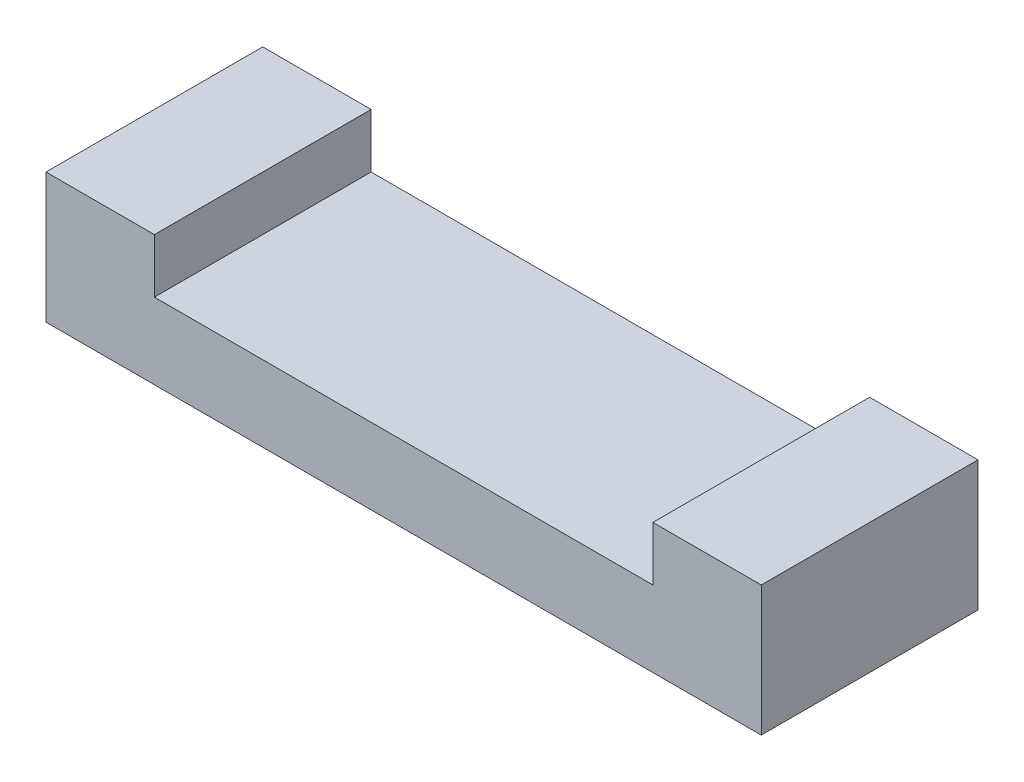
ISO-10303-21;
HEADER;
FILE_DESCRIPTION(('STEP AP214'),'2;1');
FILE_NAME('part.step','',(''),(''),'','','');
FILE_SCHEMA(('AUTOMOTIVE_DESIGN { 1 0 10303 214 1 1 1 1 }'));
ENDSEC;
DATA;
#1=APPLICATION_CONTEXT('core data for automotive mechanical design processes');
#2=APPLICATION_PROTOCOL_DEFINITION('international standard','automotive_design',2000,#1);
#3=PRODUCT_CONTEXT('',#1,'mechanical');
#4=PRODUCT('Part','Part','',(#3));
#5=PRODUCT_RELATED_PRODUCT_CATEGORY('part','',(#4));
#6=PRODUCT_DEFINITION_FORMATION('','',#4);
#7=PRODUCT_DEFINITION_CONTEXT('part definition',#1,'design');
#8=PRODUCT_DEFINITION('design','',#6,#7);
#9=PRODUCT_DEFINITION_SHAPE('','',#8);
#10=(LENGTH_UNIT() NAMED_UNIT(*) SI_UNIT(.MILLI.,.METRE.));
#11=(NAMED_UNIT(*) PLANE_ANGLE_UNIT() SI_UNIT($,.RADIAN.));
#12=(NAMED_UNIT(*) SI_UNIT($,.STERADIAN.) SOLID_ANGLE_UNIT());
#13=UNCERTAINTY_MEASURE_WITH_UNIT(LENGTH_MEASURE(1.E-05),#10,'distance_accuracy_value','');
#14=(GEOMETRIC_REPRESENTATION_CONTEXT(3) GLOBAL_UNCERTAINTY_ASSIGNED_CONTEXT((#13)) GLOBAL_UNIT_ASSIGNED_CONTEXT((#10,
#11,#12)) REPRESENTATION_CONTEXT('',''));
#15=CARTESIAN_POINT('',(0.,0.,0.));
#16=DIRECTION('',(0.,0.,1.));
#17=DIRECTION('',(1.,0.,0.));
#18=AXIS2_PLACEMENT_3D('',#15,#16,#17);
#19=CARTESIAN_POINT('',(-17.0073529411765,-3.5,10.));
#20=DIRECTION('',(1.,0.,0.));
#21=DIRECTION('',(0.,0.,-1.));
#22=AXIS2_PLACEMENT_3D('',#19,#20,#21);
#23=PLANE('',#22);
#24=DIRECTION('',(0.,-1.,0.));
#25=VECTOR('',#24,1.);
#26=CARTESIAN_POINT('',(-17.0073529411765,-3.5,0.));
#27=LINE('',#26,#25);
#28=CARTESIAN_POINT('',(-17.0073529411765,2.5,0.));
#29=VERTEX_POINT('',#28);
#30=CARTESIAN_POINT('',(-17.0073529411765,-3.5,0.));
#31=VERTEX_POINT('',#30);
#32=EDGE_CURVE('E130',#29,#31,#27,.T.);
#33=ORIENTED_EDGE('',*,*,#32,.T.);
#34=DIRECTION('',(0.,0.,-1.));
#35=VECTOR('',#34,1.);
#36=CARTESIAN_POINT('',(-17.0073529411765,-3.5,10.));
#37=LINE('',#36,#35);
#38=CARTESIAN_POINT('',(-17.0073529411765,-3.5,10.));
#39=VERTEX_POINT('',#38);
#40=EDGE_CURVE('E11',#39,#31,#37,.T.);
#41=ORIENTED_EDGE('',*,*,#40,.F.);
#42=DIRECTION('',(0.,-1.,0.));
#43=VECTOR('',#42,1.);
#44=CARTESIAN_POINT('',(-17.0073529411765,-3.5,10.));
#45=LINE('',#44,#43);
#46=CARTESIAN_POINT('',(-17.0073529411765,2.5,10.));
#47=VERTEX_POINT('',#46);
#48=EDGE_CURVE('E144',#47,#39,#45,.T.);
#49=ORIENTED_EDGE('',*,*,#48,.F.);
#50=DIRECTION('',(0.,0.,-1.));
#51=VECTOR('',#50,1.);
#52=CARTESIAN_POINT('',(-17.0073529411765,2.5,10.));
#53=LINE('',#52,#51);
#54=EDGE_CURVE('E126',#47,#29,#53,.T.);
#55=ORIENTED_EDGE('',*,*,#54,.T.);
#56=EDGE_LOOP('',(#33,#41,#49,#55));
#57=FACE_BOUND('',#56,.T.);
#58=ADVANCED_FACE('F34',(#57),#23,.F.);
#59=CARTESIAN_POINT('',(15.9926470588235,-3.5,10.));
#60=DIRECTION('',(0.,1.,0.));
#61=DIRECTION('',(-1.,0.,0.));
#62=AXIS2_PLACEMENT_3D('',#59,#60,#61);
#63=PLANE('',#62);
#64=DIRECTION('',(1.,0.,0.));
#65=VECTOR('',#64,1.);
#66=CARTESIAN_POINT('',(15.9926470588235,-3.5,0.));
#67=LINE('',#66,#65);
#68=CARTESIAN_POINT('',(15.9926470588235,-3.5,0.));
#69=VERTEX_POINT('',#68);
#70=EDGE_CURVE('E133',#31,#69,#67,.T.);
#71=ORIENTED_EDGE('',*,*,#70,.T.);
#72=DIRECTION('',(0.,0.,-1.));
#73=VECTOR('',#72,1.);
#74=CARTESIAN_POINT('',(15.9926470588235,-3.5,10.));
#75=LINE('',#74,#73);
#76=CARTESIAN_POINT('',(15.9926470588235,-3.5,10.));
#77=VERTEX_POINT('',#76);
#78=EDGE_CURVE('E42',#77,#69,#75,.T.);
#79=ORIENTED_EDGE('',*,*,#78,.F.);
#80=DIRECTION('',(1.,0.,0.));
#81=VECTOR('',#80,1.);
#82=CARTESIAN_POINT('',(15.9926470588235,-3.5,10.));
#83=LINE('',#82,#81);
#84=EDGE_CURVE('E93',#39,#77,#83,.T.);
#85=ORIENTED_EDGE('',*,*,#84,.F.);
#86=ORIENTED_EDGE('',*,*,#40,.T.);
#87=EDGE_LOOP('',(#71,#79,#85,#86));
#88=FACE_BOUND('',#87,.T.);
#89=ADVANCED_FACE('F179',(#88),#63,.F.);
#90=CARTESIAN_POINT('',(15.9926470588235,2.5,10.));
#91=DIRECTION('',(-1.,0.,0.));
#92=DIRECTION('',(0.,-1.,0.));
#93=AXIS2_PLACEMENT_3D('',#90,#91,#92);
#94=PLANE('',#93);
#95=DIRECTION('',(0.,1.,0.));
#96=VECTOR('',#95,1.);
#97=CARTESIAN_POINT('',(15.9926470588235,2.5,0.));
#98=LINE('',#97,#96);
#99=CARTESIAN_POINT('',(15.9926470588235,2.5,0.));
#100=VERTEX_POINT('',#99);
#101=EDGE_CURVE('E135',#69,#100,#98,.T.);
#102=ORIENTED_EDGE('',*,*,#101,.T.);
#103=DIRECTION('',(0.,0.,-1.));
#104=VECTOR('',#103,1.);
#105=CARTESIAN_POINT('',(15.9926470588235,2.5,10.));
#106=LINE('',#105,#104);
#107=CARTESIAN_POINT('',(15.9926470588235,2.5,10.));
#108=VERTEX_POINT('',#107);
#109=EDGE_CURVE('E151',#108,#100,#106,.T.);
#110=ORIENTED_EDGE('',*,*,#109,.F.);
#111=DIRECTION('',(0.,1.,0.));
#112=VECTOR('',#111,1.);
#113=CARTESIAN_POINT('',(15.9926470588235,2.5,10.));
#114=LINE('',#113,#112);
#115=EDGE_CURVE('E159',#77,#108,#114,.T.);
#116=ORIENTED_EDGE('',*,*,#115,.F.);
#117=ORIENTED_EDGE('',*,*,#78,.T.);
#118=EDGE_LOOP('',(#102,#110,#116,#117));
#119=FACE_BOUND('',#118,.T.);
#120=ADVANCED_FACE('F157',(#119),#94,.F.);
#121=CARTESIAN_POINT('',(10.9926470588235,2.5,10.));
#122=DIRECTION('',(0.,-1.,0.));
#123=DIRECTION('',(0.,0.,-1.));
#124=AXIS2_PLACEMENT_3D('',#121,#122,#123);
#125=PLANE('',#124);
#126=DIRECTION('',(-1.,0.,0.));
#127=VECTOR('',#126,1.);
#128=CARTESIAN_POINT('',(10.9926470588235,2.5,0.));
#129=LINE('',#128,#127);
#130=CARTESIAN_POINT('',(10.9926470588235,2.5,0.));
#131=VERTEX_POINT('',#130);
#132=EDGE_CURVE('E137',#100,#131,#129,.T.);
#133=ORIENTED_EDGE('',*,*,#132,.T.);
#134=DIRECTION('',(0.,0.,-1.));
#135=VECTOR('',#134,1.);
#136=CARTESIAN_POINT('',(10.9926470588235,2.5,10.));
#137=LINE('',#136,#135);
#138=CARTESIAN_POINT('',(10.9926470588235,2.5,10.));
#139=VERTEX_POINT('',#138);
#140=EDGE_CURVE('E148',#139,#131,#137,.T.);
#141=ORIENTED_EDGE('',*,*,#140,.F.);
#142=DIRECTION('',(-1.,0.,0.));
#143=VECTOR('',#142,1.);
#144=CARTESIAN_POINT('',(10.9926470588235,2.5,10.));
#145=LINE('',#144,#143);
#146=EDGE_CURVE('E171',#108,#139,#145,.T.);
#147=ORIENTED_EDGE('',*,*,#146,.F.);
#148=ORIENTED_EDGE('',*,*,#109,.T.);
#149=EDGE_LOOP('',(#133,#141,#147,#148));
#150=FACE_BOUND('',#149,.T.);
#151=ADVANCED_FACE('F167',(#150),#125,.F.);
#152=CARTESIAN_POINT('',(10.9926470588235,0.,10.));
#153=DIRECTION('',(1.,0.,0.));
#154=DIRECTION('',(0.,1.,0.));
#155=AXIS2_PLACEMENT_3D('',#152,#153,#154);
#156=PLANE('',#155);
#157=DIRECTION('',(0.,-1.,0.));
#158=VECTOR('',#157,1.);
#159=CARTESIAN_POINT('',(10.9926470588235,0.,0.));
#160=LINE('',#159,#158);
#161=CARTESIAN_POINT('',(10.9926470588235,0.,0.));
#162=VERTEX_POINT('',#161);
#163=EDGE_CURVE('E139',#131,#162,#160,.T.);
#164=ORIENTED_EDGE('',*,*,#163,.T.);
#165=DIRECTION('',(0.,0.,-1.));
#166=VECTOR('',#165,1.);
#167=CARTESIAN_POINT('',(10.9926470588235,0.,10.));
#168=LINE('',#167,#166);
#169=CARTESIAN_POINT('',(10.9926470588235,0.,10.));
#170=VERTEX_POINT('',#169);
#171=EDGE_CURVE('E121',#170,#162,#168,.T.);
#172=ORIENTED_EDGE('',*,*,#171,.F.);
#173=DIRECTION('',(0.,-1.,0.));
#174=VECTOR('',#173,1.);
#175=CARTESIAN_POINT('',(10.9926470588235,0.,10.));
#176=LINE('',#175,#174);
#177=EDGE_CURVE('E112',#139,#170,#176,.T.);
#178=ORIENTED_EDGE('',*,*,#177,.F.);
#179=ORIENTED_EDGE('',*,*,#140,.T.);
#180=EDGE_LOOP('',(#164,#172,#178,#179));
#181=FACE_BOUND('',#180,.T.);
#182=ADVANCED_FACE('F170',(#181),#156,.F.);
#183=CARTESIAN_POINT('',(-12.0073529411765,0.,10.));
#184=DIRECTION('',(0.,-1.,0.));
#185=DIRECTION('',(0.,0.,-1.));
#186=AXIS2_PLACEMENT_3D('',#183,#184,#185);
#187=PLANE('',#186);
#188=DIRECTION('',(-1.,0.,0.));
#189=VECTOR('',#188,1.);
#190=CARTESIAN_POINT('',(-12.0073529411765,0.,0.));
#191=LINE('',#190,#189);
#192=CARTESIAN_POINT('',(-12.0073529411765,0.,0.));
#193=VERTEX_POINT('',#192);
#194=EDGE_CURVE('E120',#162,#193,#191,.T.);
#195=ORIENTED_EDGE('',*,*,#194,.T.);
#196=DIRECTION('',(0.,0.,-1.));
#197=VECTOR('',#196,1.);
#198=CARTESIAN_POINT('',(-12.0073529411765,0.,10.));
#199=LINE('',#198,#197);
#200=CARTESIAN_POINT('',(-12.0073529411765,0.,10.));
#201=VERTEX_POINT('',#200);
#202=EDGE_CURVE('E117',#201,#193,#199,.T.);
#203=ORIENTED_EDGE('',*,*,#202,.F.);
#204=DIRECTION('',(-1.,0.,0.));
#205=VECTOR('',#204,1.);
#206=CARTESIAN_POINT('',(-12.0073529411765,0.,10.));
#207=LINE('',#206,#205);
#208=EDGE_CURVE('E106',#170,#201,#207,.T.);
#209=ORIENTED_EDGE('',*,*,#208,.F.);
#210=ORIENTED_EDGE('',*,*,#171,.T.);
#211=EDGE_LOOP('',(#195,#203,#209,#210));
#212=FACE_BOUND('',#211,.T.);
#213=ADVANCED_FACE('F118',(#212),#187,.F.);
#214=CARTESIAN_POINT('',(-12.0073529411765,2.5,10.));
#215=DIRECTION('',(-1.,0.,0.));
#216=DIRECTION('',(0.,0.,1.));
#217=AXIS2_PLACEMENT_3D('',#214,#215,#216);
#218=PLANE('',#217);
#219=DIRECTION('',(0.,1.,0.));
#220=VECTOR('',#219,1.);
#221=CARTESIAN_POINT('',(-12.0073529411765,2.5,0.));
#222=LINE('',#221,#220);
#223=CARTESIAN_POINT('',(-12.0073529411765,2.5,0.));
#224=VERTEX_POINT('',#223);
#225=EDGE_CURVE('E79',#193,#224,#222,.T.);
#226=ORIENTED_EDGE('',*,*,#225,.T.);
#227=DIRECTION('',(0.,0.,-1.));
#228=VECTOR('',#227,1.);
#229=CARTESIAN_POINT('',(-12.0073529411765,2.5,10.));
#230=LINE('',#229,#228);
#231=CARTESIAN_POINT('',(-12.0073529411765,2.5,10.));
#232=VERTEX_POINT('',#231);
#233=EDGE_CURVE('E122',#232,#224,#230,.T.);
#234=ORIENTED_EDGE('',*,*,#233,.F.);
#235=DIRECTION('',(0.,1.,0.));
#236=VECTOR('',#235,1.);
#237=CARTESIAN_POINT('',(-12.0073529411765,2.5,10.));
#238=LINE('',#237,#236);
#239=EDGE_CURVE('E110',#201,#232,#238,.T.);
#240=ORIENTED_EDGE('',*,*,#239,.F.);
#241=ORIENTED_EDGE('',*,*,#202,.T.);
#242=EDGE_LOOP('',(#226,#234,#240,#241));
#243=FACE_BOUND('',#242,.T.);
#244=ADVANCED_FACE('F124',(#243),#218,.F.);
#245=CARTESIAN_POINT('',(-17.0073529411765,2.5,10.));
#246=DIRECTION('',(0.,-1.,0.));
#247=DIRECTION('',(0.,0.,-1.));
#248=AXIS2_PLACEMENT_3D('',#245,#246,#247);
#249=PLANE('',#248);
#250=DIRECTION('',(-1.,0.,0.));
#251=VECTOR('',#250,1.);
#252=CARTESIAN_POINT('',(-17.0073529411765,2.5,0.));
#253=LINE('',#252,#251);
#254=EDGE_CURVE('E85',#224,#29,#253,.T.);
#255=ORIENTED_EDGE('',*,*,#254,.T.);
#256=ORIENTED_EDGE('',*,*,#54,.F.);
#257=DIRECTION('',(-1.,0.,0.));
#258=VECTOR('',#257,1.);
#259=CARTESIAN_POINT('',(-17.0073529411765,2.5,10.));
#260=LINE('',#259,#258);
#261=EDGE_CURVE('E50',#232,#47,#260,.T.);
#262=ORIENTED_EDGE('',*,*,#261,.F.);
#263=ORIENTED_EDGE('',*,*,#233,.T.);
#264=EDGE_LOOP('',(#255,#256,#262,#263));
#265=FACE_BOUND('',#264,.T.);
#266=ADVANCED_FACE('F195',(#265),#249,.F.);
#267=CARTESIAN_POINT('',(0.,0.,10.));
#268=DIRECTION('',(0.,0.,-1.));
#269=DIRECTION('',(-1.,0.,0.));
#270=AXIS2_PLACEMENT_3D('',#267,#268,#269);
#271=PLANE('',#270);
#272=ORIENTED_EDGE('',*,*,#48,.T.);
#273=ORIENTED_EDGE('',*,*,#84,.T.);
#274=ORIENTED_EDGE('',*,*,#115,.T.);
#275=ORIENTED_EDGE('',*,*,#146,.T.);
#276=ORIENTED_EDGE('',*,*,#177,.T.);
#277=ORIENTED_EDGE('',*,*,#208,.T.);
#278=ORIENTED_EDGE('',*,*,#239,.T.);
#279=ORIENTED_EDGE('',*,*,#261,.T.);
#280=EDGE_LOOP('',(#272,#273,#274,#275,#276,#277,#278,#279));
#281=FACE_BOUND('',#280,.T.);
#282=ADVANCED_FACE('F108',(#281),#271,.F.);
#283=CARTESIAN_POINT('',(0.,0.,0.));
#284=DIRECTION('',(0.,0.,-1.));
#285=DIRECTION('',(-1.,0.,0.));
#286=AXIS2_PLACEMENT_3D('',#283,#284,#285);
#287=PLANE('',#286);
#288=ORIENTED_EDGE('',*,*,#32,.F.);
#289=ORIENTED_EDGE('',*,*,#254,.F.);
#290=ORIENTED_EDGE('',*,*,#225,.F.);
#291=ORIENTED_EDGE('',*,*,#194,.F.);
#292=ORIENTED_EDGE('',*,*,#163,.F.);
#293=ORIENTED_EDGE('',*,*,#132,.F.);
#294=ORIENTED_EDGE('',*,*,#101,.F.);
#295=ORIENTED_EDGE('',*,*,#70,.F.);
#296=EDGE_LOOP('',(#288,#289,#290,#291,#292,#293,#294,#295));
#297=FACE_BOUND('',#296,.T.);
#298=ADVANCED_FACE('F163',(#297),#287,.T.);
#299=CLOSED_SHELL('',(#58,#89,#120,#151,#182,#213,#244,#266,#282,#298));
#300=MANIFOLD_SOLID_BREP('B2',#299);
#301=ADVANCED_BREP_SHAPE_REPRESENTATION('',(#18,#300),#14);
#302=SHAPE_DEFINITION_REPRESENTATION(#9,#301);
ENDSEC;
END-ISO-10303-21;
